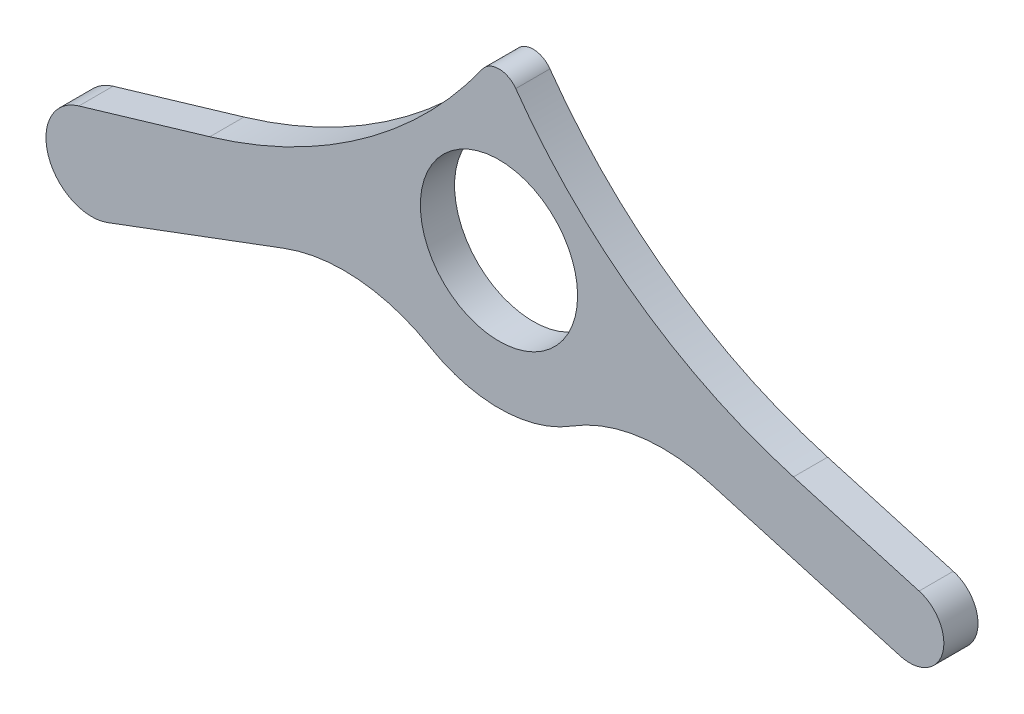
ISO-10303-21;
HEADER;
FILE_DESCRIPTION(('STEP AP214'),'2;1');
FILE_NAME('part.step','',(''),(''),'','','');
FILE_SCHEMA(('AUTOMOTIVE_DESIGN { 1 0 10303 214 1 1 1 1 }'));
ENDSEC;
DATA;
#1=APPLICATION_CONTEXT('core data for automotive mechanical design processes');
#2=APPLICATION_PROTOCOL_DEFINITION('international standard','automotive_design',2000,#1);
#3=PRODUCT_CONTEXT('',#1,'mechanical');
#4=PRODUCT('Part','Part','',(#3));
#5=PRODUCT_RELATED_PRODUCT_CATEGORY('part','',(#4));
#6=PRODUCT_DEFINITION_FORMATION('','',#4);
#7=PRODUCT_DEFINITION_CONTEXT('part definition',#1,'design');
#8=PRODUCT_DEFINITION('design','',#6,#7);
#9=PRODUCT_DEFINITION_SHAPE('','',#8);
#10=(LENGTH_UNIT() NAMED_UNIT(*) SI_UNIT(.MILLI.,.METRE.));
#11=(NAMED_UNIT(*) PLANE_ANGLE_UNIT() SI_UNIT($,.RADIAN.));
#12=(NAMED_UNIT(*) SI_UNIT($,.STERADIAN.) SOLID_ANGLE_UNIT());
#13=UNCERTAINTY_MEASURE_WITH_UNIT(LENGTH_MEASURE(1.E-05),#10,'distance_accuracy_value','');
#14=(GEOMETRIC_REPRESENTATION_CONTEXT(3) GLOBAL_UNCERTAINTY_ASSIGNED_CONTEXT((#13)) GLOBAL_UNIT_ASSIGNED_CONTEXT((#10,
#11,#12)) REPRESENTATION_CONTEXT('',''));
#15=CARTESIAN_POINT('',(0.,0.,0.));
#16=DIRECTION('',(0.,0.,1.));
#17=DIRECTION('',(1.,0.,0.));
#18=AXIS2_PLACEMENT_3D('',#15,#16,#17);
#19=CARTESIAN_POINT('',(60.0788559961449,-17.2273347385625,5.));
#20=DIRECTION('',(0.,0.,-1.));
#21=DIRECTION('',(-1.,0.,0.));
#22=AXIS2_PLACEMENT_3D('',#19,#20,#21);
#23=PLANE('',#22);
#24=CARTESIAN_POINT('',(60.0788559961449,-17.2273347385625,5.));
#25=DIRECTION('',(0.,0.,1.));
#26=DIRECTION('',(-1.,0.,0.));
#27=AXIS2_PLACEMENT_3D('',#24,#25,#26);
#28=CIRCLE('',#27,5.);
#29=CARTESIAN_POINT('',(58.7006692170599,-22.0336432182541,5.));
#30=VERTEX_POINT('',#29);
#31=CARTESIAN_POINT('',(61.4570427752299,-12.4210262588709,5.));
#32=VERTEX_POINT('',#31);
#33=EDGE_CURVE('E189',#30,#32,#28,.T.);
#34=ORIENTED_EDGE('',*,*,#33,.T.);
#35=DIRECTION('',(-0.961261695938319,0.275637355816999,0.));
#36=VECTOR('',#35,1.);
#37=CARTESIAN_POINT('',(43.0770023879075,-7.15063448774567,5.));
#38=LINE('',#37,#36);
#39=CARTESIAN_POINT('',(43.0770023879075,-7.15063448774565,5.));
#40=VERTEX_POINT('',#39);
#41=EDGE_CURVE('E113',#32,#40,#38,.T.);
#42=ORIENTED_EDGE('',*,*,#41,.T.);
#43=CARTESIAN_POINT('',(63.7498040741825,64.9439927076283,5.));
#44=DIRECTION('',(0.,0.,-1.));
#45=DIRECTION('',(1.,0.,0.));
#46=AXIS2_PLACEMENT_3D('',#43,#44,#45);
#47=CIRCLE('',#46,75.);
#48=CARTESIAN_POINT('',(2.45191554131471,21.7286151041395,5.));
#49=VERTEX_POINT('',#48);
#50=EDGE_CURVE('E212',#40,#49,#47,.T.);
#51=ORIENTED_EDGE('',*,*,#50,.T.);
#52=CARTESIAN_POINT('',(0.,20.,5.));
#53=DIRECTION('',(0.,0.,1.));
#54=DIRECTION('',(1.,0.,0.));
#55=AXIS2_PLACEMENT_3D('',#52,#53,#54);
#56=CIRCLE('',#55,3.);
#57=CARTESIAN_POINT('',(-2.4519155413147,21.7286151041396,5.));
#58=VERTEX_POINT('',#57);
#59=EDGE_CURVE('E235',#49,#58,#56,.T.);
#60=ORIENTED_EDGE('',*,*,#59,.T.);
#61=CARTESIAN_POINT('',(-63.5941172501392,65.1639828382501,5.));
#62=DIRECTION('',(0.,0.,-1.));
#63=DIRECTION('',(-1.,0.,0.));
#64=AXIS2_PLACEMENT_3D('',#61,#62,#63);
#65=CIRCLE('',#64,75.);
#66=CARTESIAN_POINT('',(-42.3037645493542,-6.75069495339525,5.));
#67=VERTEX_POINT('',#66);
#68=EDGE_CURVE('E228',#58,#67,#65,.T.);
#69=ORIENTED_EDGE('',*,*,#68,.T.);
#70=DIRECTION('',(-0.958862370555272,-0.283871369343801,0.));
#71=VECTOR('',#70,1.);
#72=CARTESIAN_POINT('',(-42.3037645493542,-6.75069495339525,5.));
#73=LINE('',#72,#71);
#74=CARTESIAN_POINT('',(-61.4570427752299,-12.4210262588709,5.));
#75=VERTEX_POINT('',#74);
#76=EDGE_CURVE('E234',#67,#75,#73,.T.);
#77=ORIENTED_EDGE('',*,*,#76,.T.);
#78=CARTESIAN_POINT('',(-59.5931878134191,-18.8388419557721,5.));
#79=DIRECTION('',(0.,0.,1.));
#80=DIRECTION('',(1.,0.,0.));
#81=AXIS2_PLACEMENT_3D('',#78,#79,#80);
#82=CIRCLE('',#81,6.68298687998549);
#83=CARTESIAN_POINT('',(-57.2409921835093,-25.0941988086376,5.));
#84=VERTEX_POINT('',#83);
#85=EDGE_CURVE('E233',#75,#84,#82,.T.);
#86=ORIENTED_EDGE('',*,*,#85,.T.);
#87=DIRECTION('',(0.936724764290516,0.350066730731266,0.));
#88=VECTOR('',#87,1.);
#89=CARTESIAN_POINT('',(-57.2409921835093,-25.0941988086376,5.));
#90=LINE('',#89,#88);
#91=CARTESIAN_POINT('',(-31.4312925565472,-15.4487645103249,5.));
#92=VERTEX_POINT('',#91);
#93=EDGE_CURVE('E242',#84,#92,#90,.T.);
#94=ORIENTED_EDGE('',*,*,#93,.T.);
#95=CARTESIAN_POINT('',(-22.6796242882655,-38.8668836175878,5.));
#96=DIRECTION('',(0.,0.,-1.));
#97=DIRECTION('',(1.,0.,0.));
#98=AXIS2_PLACEMENT_3D('',#95,#96,#97);
#99=CIRCLE('',#98,25.);
#100=CARTESIAN_POINT('',(-10.0798330170069,-17.2741704967057,5.));
#101=VERTEX_POINT('',#100);
#102=EDGE_CURVE('E148',#92,#101,#99,.T.);
#103=ORIENTED_EDGE('',*,*,#102,.T.);
#104=CARTESIAN_POINT('',(0.,0.,5.));
#105=DIRECTION('',(0.,0.,1.));
#106=DIRECTION('',(1.,0.,0.));
#107=AXIS2_PLACEMENT_3D('',#104,#105,#106);
#108=CIRCLE('',#107,20.);
#109=CARTESIAN_POINT('',(10.6544785643388,-16.9257817108116,5.));
#110=VERTEX_POINT('',#109);
#111=EDGE_CURVE('E138',#101,#110,#108,.T.);
#112=ORIENTED_EDGE('',*,*,#111,.T.);
#113=CARTESIAN_POINT('',(23.9725767697622,-38.0830088493262,5.));
#114=DIRECTION('',(0.,0.,-1.));
#115=DIRECTION('',(1.,0.,0.));
#116=AXIS2_PLACEMENT_3D('',#113,#114,#115);
#117=CIRCLE('',#116,25.);
#118=CARTESIAN_POINT('',(30.8635106651872,-14.0514664508682,5.));
#119=VERTEX_POINT('',#118);
#120=EDGE_CURVE('E145',#110,#119,#117,.T.);
#121=ORIENTED_EDGE('',*,*,#120,.T.);
#122=DIRECTION('',(0.961261695938319,-0.275637355817,0.));
#123=VECTOR('',#122,1.);
#124=CARTESIAN_POINT('',(30.8635106651872,-14.0514664508682,5.));
#125=LINE('',#124,#123);
#126=EDGE_CURVE('E58',#119,#30,#125,.T.);
#127=ORIENTED_EDGE('',*,*,#126,.T.);
#128=EDGE_LOOP('',(#34,#42,#51,#60,#69,#77,#86,#94,#103,#112,#121,#127));
#129=FACE_BOUND('',#128,.T.);
#130=CARTESIAN_POINT('',(0.,0.,5.));
#131=DIRECTION('',(0.,0.,1.));
#132=DIRECTION('',(1.,0.,0.));
#133=AXIS2_PLACEMENT_3D('',#130,#131,#132);
#134=CIRCLE('',#133,11.5);
#135=CARTESIAN_POINT('',(11.5,0.,5.));
#136=VERTEX_POINT('',#135);
#137=EDGE_CURVE('E169',#136,#136,#134,.T.);
#138=ORIENTED_EDGE('',*,*,#137,.F.);
#139=EDGE_LOOP('',(#138));
#140=FACE_BOUND('',#139,.T.);
#141=ADVANCED_FACE('F43',(#129,#140),#23,.F.);
#142=CARTESIAN_POINT('',(60.0788559961449,-17.2273347385625,0.));
#143=DIRECTION('',(0.,0.,-1.));
#144=DIRECTION('',(-1.,0.,0.));
#145=AXIS2_PLACEMENT_3D('',#142,#143,#144);
#146=PLANE('',#145);
#147=CARTESIAN_POINT('',(60.0788559961449,-17.2273347385625,0.));
#148=DIRECTION('',(0.,0.,1.));
#149=DIRECTION('',(-1.,0.,0.));
#150=AXIS2_PLACEMENT_3D('',#147,#148,#149);
#151=CIRCLE('',#150,5.);
#152=CARTESIAN_POINT('',(58.7006692170599,-22.0336432182541,0.));
#153=VERTEX_POINT('',#152);
#154=CARTESIAN_POINT('',(61.4570427752299,-12.4210262588709,0.));
#155=VERTEX_POINT('',#154);
#156=EDGE_CURVE('E163',#153,#155,#151,.T.);
#157=ORIENTED_EDGE('',*,*,#156,.F.);
#158=DIRECTION('',(0.961261695938319,-0.275637355817,0.));
#159=VECTOR('',#158,1.);
#160=CARTESIAN_POINT('',(30.8635106651872,-14.0514664508682,0.));
#161=LINE('',#160,#159);
#162=CARTESIAN_POINT('',(30.8635106651872,-14.0514664508682,0.));
#163=VERTEX_POINT('',#162);
#164=EDGE_CURVE('E110',#163,#153,#161,.T.);
#165=ORIENTED_EDGE('',*,*,#164,.F.);
#166=CARTESIAN_POINT('',(23.9725767697622,-38.0830088493262,0.));
#167=DIRECTION('',(0.,0.,-1.));
#168=DIRECTION('',(1.,0.,0.));
#169=AXIS2_PLACEMENT_3D('',#166,#167,#168);
#170=CIRCLE('',#169,25.);
#171=CARTESIAN_POINT('',(10.6544785643388,-16.9257817108116,0.));
#172=VERTEX_POINT('',#171);
#173=EDGE_CURVE('E101',#172,#163,#170,.T.);
#174=ORIENTED_EDGE('',*,*,#173,.F.);
#175=CARTESIAN_POINT('',(0.,0.,0.));
#176=DIRECTION('',(0.,0.,1.));
#177=DIRECTION('',(1.,0.,0.));
#178=AXIS2_PLACEMENT_3D('',#175,#176,#177);
#179=CIRCLE('',#178,20.);
#180=CARTESIAN_POINT('',(-10.0798330170069,-17.2741704967057,0.));
#181=VERTEX_POINT('',#180);
#182=EDGE_CURVE('E152',#181,#172,#179,.T.);
#183=ORIENTED_EDGE('',*,*,#182,.F.);
#184=CARTESIAN_POINT('',(-22.6796242882655,-38.8668836175878,0.));
#185=DIRECTION('',(0.,0.,-1.));
#186=DIRECTION('',(1.,0.,0.));
#187=AXIS2_PLACEMENT_3D('',#184,#185,#186);
#188=CIRCLE('',#187,25.);
#189=CARTESIAN_POINT('',(-31.4312925565472,-15.4487645103249,0.));
#190=VERTEX_POINT('',#189);
#191=EDGE_CURVE('E185',#190,#181,#188,.T.);
#192=ORIENTED_EDGE('',*,*,#191,.F.);
#193=DIRECTION('',(0.936724764290516,0.350066730731266,0.));
#194=VECTOR('',#193,1.);
#195=CARTESIAN_POINT('',(-57.2409921835093,-25.0941988086376,0.));
#196=LINE('',#195,#194);
#197=CARTESIAN_POINT('',(-57.2409921835093,-25.0941988086376,0.));
#198=VERTEX_POINT('',#197);
#199=EDGE_CURVE('E178',#198,#190,#196,.T.);
#200=ORIENTED_EDGE('',*,*,#199,.F.);
#201=CARTESIAN_POINT('',(-59.5931878134191,-18.8388419557721,0.));
#202=DIRECTION('',(0.,0.,1.));
#203=DIRECTION('',(1.,0.,0.));
#204=AXIS2_PLACEMENT_3D('',#201,#202,#203);
#205=CIRCLE('',#204,6.68298687998549);
#206=CARTESIAN_POINT('',(-61.4570427752299,-12.4210262588709,0.));
#207=VERTEX_POINT('',#206);
#208=EDGE_CURVE('E180',#207,#198,#205,.T.);
#209=ORIENTED_EDGE('',*,*,#208,.F.);
#210=DIRECTION('',(-0.958862370555272,-0.283871369343801,0.));
#211=VECTOR('',#210,1.);
#212=CARTESIAN_POINT('',(-42.3037645493542,-6.75069495339525,0.));
#213=LINE('',#212,#211);
#214=CARTESIAN_POINT('',(-42.3037645493542,-6.75069495339525,0.));
#215=VERTEX_POINT('',#214);
#216=EDGE_CURVE('E177',#215,#207,#213,.T.);
#217=ORIENTED_EDGE('',*,*,#216,.F.);
#218=CARTESIAN_POINT('',(-63.5941172501392,65.1639828382501,0.));
#219=DIRECTION('',(0.,0.,-1.));
#220=DIRECTION('',(-1.,0.,0.));
#221=AXIS2_PLACEMENT_3D('',#218,#219,#220);
#222=CIRCLE('',#221,75.);
#223=CARTESIAN_POINT('',(-2.4519155413147,21.7286151041396,0.));
#224=VERTEX_POINT('',#223);
#225=EDGE_CURVE('E171',#224,#215,#222,.T.);
#226=ORIENTED_EDGE('',*,*,#225,.F.);
#227=CARTESIAN_POINT('',(0.,20.,0.));
#228=DIRECTION('',(0.,0.,1.));
#229=DIRECTION('',(1.,0.,0.));
#230=AXIS2_PLACEMENT_3D('',#227,#228,#229);
#231=CIRCLE('',#230,3.);
#232=CARTESIAN_POINT('',(2.45191554131471,21.7286151041395,0.));
#233=VERTEX_POINT('',#232);
#234=EDGE_CURVE('E174',#233,#224,#231,.T.);
#235=ORIENTED_EDGE('',*,*,#234,.F.);
#236=CARTESIAN_POINT('',(63.7498040741825,64.9439927076283,0.));
#237=DIRECTION('',(0.,0.,-1.));
#238=DIRECTION('',(1.,0.,0.));
#239=AXIS2_PLACEMENT_3D('',#236,#237,#238);
#240=CIRCLE('',#239,75.);
#241=CARTESIAN_POINT('',(43.0770023879075,-7.15063448774565,0.));
#242=VERTEX_POINT('',#241);
#243=EDGE_CURVE('E168',#242,#233,#240,.T.);
#244=ORIENTED_EDGE('',*,*,#243,.F.);
#245=DIRECTION('',(-0.961261695938319,0.275637355816999,0.));
#246=VECTOR('',#245,1.);
#247=CARTESIAN_POINT('',(43.0770023879075,-7.15063448774567,0.));
#248=LINE('',#247,#246);
#249=EDGE_CURVE('E170',#155,#242,#248,.T.);
#250=ORIENTED_EDGE('',*,*,#249,.F.);
#251=EDGE_LOOP('',(#157,#165,#174,#183,#192,#200,#209,#217,#226,#235,#244,#250));
#252=FACE_BOUND('',#251,.T.);
#253=CARTESIAN_POINT('',(0.,0.,0.));
#254=DIRECTION('',(0.,0.,1.));
#255=DIRECTION('',(1.,0.,0.));
#256=AXIS2_PLACEMENT_3D('',#253,#254,#255);
#257=CIRCLE('',#256,11.5);
#258=CARTESIAN_POINT('',(11.5,0.,0.));
#259=VERTEX_POINT('',#258);
#260=EDGE_CURVE('E389',#259,#259,#257,.T.);
#261=ORIENTED_EDGE('',*,*,#260,.T.);
#262=EDGE_LOOP('',(#261));
#263=FACE_BOUND('',#262,.T.);
#264=ADVANCED_FACE('F217',(#252,#263),#146,.T.);
#265=CARTESIAN_POINT('',(60.0788559961449,-17.2273347385625,5.));
#266=DIRECTION('',(0.,0.,-1.));
#267=DIRECTION('',(-1.,0.,0.));
#268=AXIS2_PLACEMENT_3D('',#265,#266,#267);
#269=CYLINDRICAL_SURFACE('',#268,5.);
#270=ORIENTED_EDGE('',*,*,#156,.T.);
#271=DIRECTION('',(0.,0.,-1.));
#272=VECTOR('',#271,1.);
#273=CARTESIAN_POINT('',(61.4570427752299,-12.4210262588709,5.));
#274=LINE('',#273,#272);
#275=EDGE_CURVE('E11',#32,#155,#274,.T.);
#276=ORIENTED_EDGE('',*,*,#275,.F.);
#277=ORIENTED_EDGE('',*,*,#33,.F.);
#278=DIRECTION('',(0.,0.,-1.));
#279=VECTOR('',#278,1.);
#280=CARTESIAN_POINT('',(58.7006692170599,-22.0336432182541,5.));
#281=LINE('',#280,#279);
#282=EDGE_CURVE('E159',#30,#153,#281,.T.);
#283=ORIENTED_EDGE('',*,*,#282,.T.);
#284=EDGE_LOOP('',(#270,#276,#277,#283));
#285=FACE_BOUND('',#284,.T.);
#286=ADVANCED_FACE('F44',(#285),#269,.T.);
#287=CARTESIAN_POINT('',(43.0770023879075,-7.15063448774567,5.));
#288=DIRECTION('',(-0.275637355816999,-0.961261695938319,0.));
#289=DIRECTION('',(0.961261695938319,-0.275637355816999,0.));
#290=AXIS2_PLACEMENT_3D('',#287,#288,#289);
#291=PLANE('',#290);
#292=ORIENTED_EDGE('',*,*,#249,.T.);
#293=DIRECTION('',(0.,0.,-1.));
#294=VECTOR('',#293,1.);
#295=CARTESIAN_POINT('',(43.0770023879075,-7.15063448774565,5.));
#296=LINE('',#295,#294);
#297=EDGE_CURVE('E55',#40,#242,#296,.T.);
#298=ORIENTED_EDGE('',*,*,#297,.F.);
#299=ORIENTED_EDGE('',*,*,#41,.F.);
#300=ORIENTED_EDGE('',*,*,#275,.T.);
#301=EDGE_LOOP('',(#292,#298,#299,#300));
#302=FACE_BOUND('',#301,.T.);
#303=ADVANCED_FACE('F274',(#302),#291,.F.);
#304=CARTESIAN_POINT('',(63.7498040741825,64.9439927076283,5.));
#305=DIRECTION('',(0.,0.,-1.));
#306=DIRECTION('',(-1.,0.,0.));
#307=AXIS2_PLACEMENT_3D('',#304,#305,#306);
#308=CYLINDRICAL_SURFACE('',#307,75.);
#309=ORIENTED_EDGE('',*,*,#243,.T.);
#310=DIRECTION('',(0.,0.,-1.));
#311=VECTOR('',#310,1.);
#312=CARTESIAN_POINT('',(2.45191554131471,21.7286151041395,5.));
#313=LINE('',#312,#311);
#314=EDGE_CURVE('E206',#49,#233,#313,.T.);
#315=ORIENTED_EDGE('',*,*,#314,.F.);
#316=ORIENTED_EDGE('',*,*,#50,.F.);
#317=ORIENTED_EDGE('',*,*,#297,.T.);
#318=EDGE_LOOP('',(#309,#315,#316,#317));
#319=FACE_BOUND('',#318,.T.);
#320=ADVANCED_FACE('F215',(#319),#308,.F.);
#321=CARTESIAN_POINT('',(0.,20.,5.));
#322=DIRECTION('',(0.,0.,-1.));
#323=DIRECTION('',(-1.,0.,0.));
#324=AXIS2_PLACEMENT_3D('',#321,#322,#323);
#325=CYLINDRICAL_SURFACE('',#324,3.);
#326=ORIENTED_EDGE('',*,*,#234,.T.);
#327=DIRECTION('',(0.,0.,-1.));
#328=VECTOR('',#327,1.);
#329=CARTESIAN_POINT('',(-2.4519155413147,21.7286151041396,5.));
#330=LINE('',#329,#328);
#331=EDGE_CURVE('E201',#58,#224,#330,.T.);
#332=ORIENTED_EDGE('',*,*,#331,.F.);
#333=ORIENTED_EDGE('',*,*,#59,.F.);
#334=ORIENTED_EDGE('',*,*,#314,.T.);
#335=EDGE_LOOP('',(#326,#332,#333,#334));
#336=FACE_BOUND('',#335,.T.);
#337=ADVANCED_FACE('F221',(#336),#325,.T.);
#338=CARTESIAN_POINT('',(-63.5941172501392,65.1639828382501,5.));
#339=DIRECTION('',(0.,0.,-1.));
#340=DIRECTION('',(-1.,0.,0.));
#341=AXIS2_PLACEMENT_3D('',#338,#339,#340);
#342=CYLINDRICAL_SURFACE('',#341,75.);
#343=ORIENTED_EDGE('',*,*,#225,.T.);
#344=DIRECTION('',(0.,0.,-1.));
#345=VECTOR('',#344,1.);
#346=CARTESIAN_POINT('',(-42.3037645493542,-6.75069495339525,5.));
#347=LINE('',#346,#345);
#348=EDGE_CURVE('E199',#67,#215,#347,.T.);
#349=ORIENTED_EDGE('',*,*,#348,.F.);
#350=ORIENTED_EDGE('',*,*,#68,.F.);
#351=ORIENTED_EDGE('',*,*,#331,.T.);
#352=EDGE_LOOP('',(#343,#349,#350,#351));
#353=FACE_BOUND('',#352,.T.);
#354=ADVANCED_FACE('F230',(#353),#342,.F.);
#355=CARTESIAN_POINT('',(-42.3037645493542,-6.75069495339525,5.));
#356=DIRECTION('',(0.283871369343801,-0.958862370555272,0.));
#357=DIRECTION('',(0.958862370555272,0.283871369343801,0.));
#358=AXIS2_PLACEMENT_3D('',#355,#356,#357);
#359=PLANE('',#358);
#360=ORIENTED_EDGE('',*,*,#216,.T.);
#361=DIRECTION('',(0.,0.,-1.));
#362=VECTOR('',#361,1.);
#363=CARTESIAN_POINT('',(-61.4570427752299,-12.4210262588709,5.));
#364=LINE('',#363,#362);
#365=EDGE_CURVE('E197',#75,#207,#364,.T.);
#366=ORIENTED_EDGE('',*,*,#365,.F.);
#367=ORIENTED_EDGE('',*,*,#76,.F.);
#368=ORIENTED_EDGE('',*,*,#348,.T.);
#369=EDGE_LOOP('',(#360,#366,#367,#368));
#370=FACE_BOUND('',#369,.T.);
#371=ADVANCED_FACE('F290',(#370),#359,.F.);
#372=CARTESIAN_POINT('',(-59.5931878134191,-18.8388419557721,5.));
#373=DIRECTION('',(0.,0.,-1.));
#374=DIRECTION('',(-1.,0.,0.));
#375=AXIS2_PLACEMENT_3D('',#372,#373,#374);
#376=CYLINDRICAL_SURFACE('',#375,6.68298687998549);
#377=ORIENTED_EDGE('',*,*,#208,.T.);
#378=DIRECTION('',(0.,0.,-1.));
#379=VECTOR('',#378,1.);
#380=CARTESIAN_POINT('',(-57.2409921835093,-25.0941988086376,5.));
#381=LINE('',#380,#379);
#382=EDGE_CURVE('E191',#84,#198,#381,.T.);
#383=ORIENTED_EDGE('',*,*,#382,.F.);
#384=ORIENTED_EDGE('',*,*,#85,.F.);
#385=ORIENTED_EDGE('',*,*,#365,.T.);
#386=EDGE_LOOP('',(#377,#383,#384,#385));
#387=FACE_BOUND('',#386,.T.);
#388=ADVANCED_FACE('F292',(#387),#376,.T.);
#389=CARTESIAN_POINT('',(-57.2409921835093,-25.0941988086376,5.));
#390=DIRECTION('',(-0.350066730731266,0.936724764290516,0.));
#391=DIRECTION('',(-0.936724764290517,-0.350066730731266,0.));
#392=AXIS2_PLACEMENT_3D('',#389,#390,#391);
#393=PLANE('',#392);
#394=ORIENTED_EDGE('',*,*,#199,.T.);
#395=DIRECTION('',(0.,0.,-1.));
#396=VECTOR('',#395,1.);
#397=CARTESIAN_POINT('',(-31.4312925565472,-15.4487645103249,5.));
#398=LINE('',#397,#396);
#399=EDGE_CURVE('E192',#92,#190,#398,.T.);
#400=ORIENTED_EDGE('',*,*,#399,.F.);
#401=ORIENTED_EDGE('',*,*,#93,.F.);
#402=ORIENTED_EDGE('',*,*,#382,.T.);
#403=EDGE_LOOP('',(#394,#400,#401,#402));
#404=FACE_BOUND('',#403,.T.);
#405=ADVANCED_FACE('F249',(#404),#393,.F.);
#406=CARTESIAN_POINT('',(-22.6796242882655,-38.8668836175878,5.));
#407=DIRECTION('',(0.,0.,-1.));
#408=DIRECTION('',(-1.,0.,0.));
#409=AXIS2_PLACEMENT_3D('',#406,#407,#408);
#410=CYLINDRICAL_SURFACE('',#409,25.);
#411=ORIENTED_EDGE('',*,*,#191,.T.);
#412=DIRECTION('',(0.,0.,-1.));
#413=VECTOR('',#412,1.);
#414=CARTESIAN_POINT('',(-10.0798330170069,-17.2741704967057,5.));
#415=LINE('',#414,#413);
#416=EDGE_CURVE('E154',#101,#181,#415,.T.);
#417=ORIENTED_EDGE('',*,*,#416,.F.);
#418=ORIENTED_EDGE('',*,*,#102,.F.);
#419=ORIENTED_EDGE('',*,*,#399,.T.);
#420=EDGE_LOOP('',(#411,#417,#418,#419));
#421=FACE_BOUND('',#420,.T.);
#422=ADVANCED_FACE('F253',(#421),#410,.F.);
#423=CARTESIAN_POINT('',(0.,0.,5.));
#424=DIRECTION('',(0.,0.,-1.));
#425=DIRECTION('',(-1.,0.,0.));
#426=AXIS2_PLACEMENT_3D('',#423,#424,#425);
#427=CYLINDRICAL_SURFACE('',#426,20.);
#428=ORIENTED_EDGE('',*,*,#182,.T.);
#429=DIRECTION('',(0.,0.,-1.));
#430=VECTOR('',#429,1.);
#431=CARTESIAN_POINT('',(10.6544785643388,-16.9257817108116,5.));
#432=LINE('',#431,#430);
#433=EDGE_CURVE('E151',#110,#172,#432,.T.);
#434=ORIENTED_EDGE('',*,*,#433,.F.);
#435=ORIENTED_EDGE('',*,*,#111,.F.);
#436=ORIENTED_EDGE('',*,*,#416,.T.);
#437=EDGE_LOOP('',(#428,#434,#435,#436));
#438=FACE_BOUND('',#437,.T.);
#439=ADVANCED_FACE('F155',(#438),#427,.T.);
#440=CARTESIAN_POINT('',(23.9725767697622,-38.0830088493262,5.));
#441=DIRECTION('',(0.,0.,-1.));
#442=DIRECTION('',(-1.,0.,0.));
#443=AXIS2_PLACEMENT_3D('',#440,#441,#442);
#444=CYLINDRICAL_SURFACE('',#443,25.);
#445=ORIENTED_EDGE('',*,*,#173,.T.);
#446=DIRECTION('',(0.,0.,-1.));
#447=VECTOR('',#446,1.);
#448=CARTESIAN_POINT('',(30.8635106651872,-14.0514664508682,5.));
#449=LINE('',#448,#447);
#450=EDGE_CURVE('E156',#119,#163,#449,.T.);
#451=ORIENTED_EDGE('',*,*,#450,.F.);
#452=ORIENTED_EDGE('',*,*,#120,.F.);
#453=ORIENTED_EDGE('',*,*,#433,.T.);
#454=EDGE_LOOP('',(#445,#451,#452,#453));
#455=FACE_BOUND('',#454,.T.);
#456=ADVANCED_FACE('F158',(#455),#444,.F.);
#457=CARTESIAN_POINT('',(30.8635106651872,-14.0514664508682,5.));
#458=DIRECTION('',(0.275637355817,0.961261695938319,0.));
#459=DIRECTION('',(-0.961261695938319,0.275637355817,0.));
#460=AXIS2_PLACEMENT_3D('',#457,#458,#459);
#461=PLANE('',#460);
#462=ORIENTED_EDGE('',*,*,#164,.T.);
#463=ORIENTED_EDGE('',*,*,#282,.F.);
#464=ORIENTED_EDGE('',*,*,#126,.F.);
#465=ORIENTED_EDGE('',*,*,#450,.T.);
#466=EDGE_LOOP('',(#462,#463,#464,#465));
#467=FACE_BOUND('',#466,.T.);
#468=ADVANCED_FACE('F254',(#467),#461,.F.);
#469=CARTESIAN_POINT('',(0.,0.,5.));
#470=DIRECTION('',(0.,0.,-1.));
#471=DIRECTION('',(-1.,0.,0.));
#472=AXIS2_PLACEMENT_3D('',#469,#470,#471);
#473=CYLINDRICAL_SURFACE('',#472,11.5);
#474=ORIENTED_EDGE('',*,*,#137,.T.);
#475=EDGE_LOOP('',(#474));
#476=FACE_BOUND('',#475,.T.);
#477=ORIENTED_EDGE('',*,*,#260,.F.);
#478=EDGE_LOOP('',(#477));
#479=FACE_BOUND('',#478,.T.);
#480=ADVANCED_FACE('F260',(#476,#479),#473,.F.);
#481=CLOSED_SHELL('',(#141,#264,#286,#303,#320,#337,#354,#371,#388,#405,#422,#439,#456,#468,#480));
#482=MANIFOLD_SOLID_BREP('B2',#481);
#483=ADVANCED_BREP_SHAPE_REPRESENTATION('',(#18,#482),#14);
#484=SHAPE_DEFINITION_REPRESENTATION(#9,#483);
ENDSEC;
END-ISO-10303-21;
